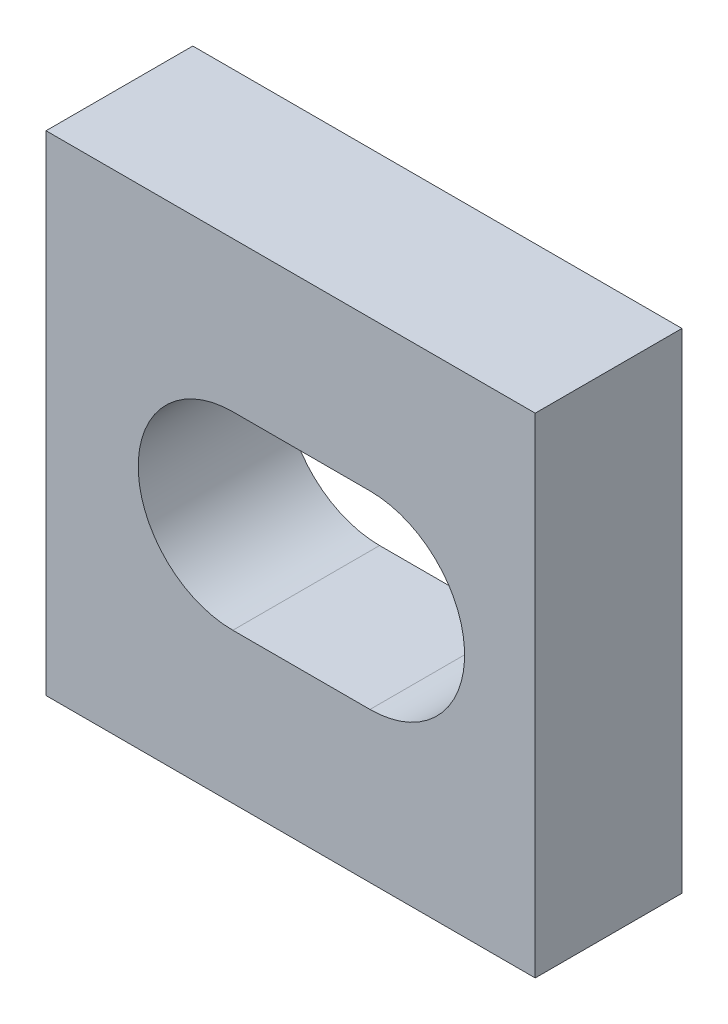
ISO-10303-21;
HEADER;
FILE_DESCRIPTION(('STEP AP214'),'2;1');
FILE_NAME('part.step','',(''),(''),'','','');
FILE_SCHEMA(('AUTOMOTIVE_DESIGN { 1 0 10303 214 1 1 1 1 }'));
ENDSEC;
DATA;
#1=APPLICATION_CONTEXT('core data for automotive mechanical design processes');
#2=APPLICATION_PROTOCOL_DEFINITION('international standard','automotive_design',2000,#1);
#3=PRODUCT_CONTEXT('',#1,'mechanical');
#4=PRODUCT('Part','Part','',(#3));
#5=PRODUCT_RELATED_PRODUCT_CATEGORY('part','',(#4));
#6=PRODUCT_DEFINITION_FORMATION('','',#4);
#7=PRODUCT_DEFINITION_CONTEXT('part definition',#1,'design');
#8=PRODUCT_DEFINITION('design','',#6,#7);
#9=PRODUCT_DEFINITION_SHAPE('','',#8);
#10=(LENGTH_UNIT() NAMED_UNIT(*) SI_UNIT(.MILLI.,.METRE.));
#11=(NAMED_UNIT(*) PLANE_ANGLE_UNIT() SI_UNIT($,.RADIAN.));
#12=(NAMED_UNIT(*) SI_UNIT($,.STERADIAN.) SOLID_ANGLE_UNIT());
#13=UNCERTAINTY_MEASURE_WITH_UNIT(LENGTH_MEASURE(1.E-05),#10,'distance_accuracy_value','');
#14=(GEOMETRIC_REPRESENTATION_CONTEXT(3) GLOBAL_UNCERTAINTY_ASSIGNED_CONTEXT((#13)) GLOBAL_UNIT_ASSIGNED_CONTEXT((#10,
#11,#12)) REPRESENTATION_CONTEXT('',''));
#15=CARTESIAN_POINT('',(0.,0.,0.));
#16=DIRECTION('',(0.,0.,1.));
#17=DIRECTION('',(1.,0.,0.));
#18=AXIS2_PLACEMENT_3D('',#15,#16,#17);
#19=CARTESIAN_POINT('',(0.,0.,3.));
#20=DIRECTION('',(0.,0.,1.));
#21=DIRECTION('',(1.,0.,0.));
#22=AXIS2_PLACEMENT_3D('',#19,#20,#21);
#23=PLANE('',#22);
#24=DIRECTION('',(0.,-1.,0.));
#25=VECTOR('',#24,1.);
#26=CARTESIAN_POINT('',(0.,0.,3.));
#27=LINE('',#26,#25);
#28=CARTESIAN_POINT('',(0.,0.,3.));
#29=VERTEX_POINT('',#28);
#30=CARTESIAN_POINT('',(0.,-10.,3.));
#31=VERTEX_POINT('',#30);
#32=EDGE_CURVE('E137',#29,#31,#27,.T.);
#33=ORIENTED_EDGE('',*,*,#32,.T.);
#34=DIRECTION('',(1.,0.,0.));
#35=VECTOR('',#34,1.);
#36=CARTESIAN_POINT('',(0.,-10.,3.));
#37=LINE('',#36,#35);
#38=CARTESIAN_POINT('',(10.,-10.,3.));
#39=VERTEX_POINT('',#38);
#40=EDGE_CURVE('E140',#31,#39,#37,.T.);
#41=ORIENTED_EDGE('',*,*,#40,.T.);
#42=DIRECTION('',(0.,1.,0.));
#43=VECTOR('',#42,1.);
#44=CARTESIAN_POINT('',(10.,0.,3.));
#45=LINE('',#44,#43);
#46=CARTESIAN_POINT('',(10.,0.,3.));
#47=VERTEX_POINT('',#46);
#48=EDGE_CURVE('E143',#39,#47,#45,.T.);
#49=ORIENTED_EDGE('',*,*,#48,.T.);
#50=DIRECTION('',(-1.,0.,0.));
#51=VECTOR('',#50,1.);
#52=CARTESIAN_POINT('',(0.,0.,3.));
#53=LINE('',#52,#51);
#54=EDGE_CURVE('E145',#47,#29,#53,.T.);
#55=ORIENTED_EDGE('',*,*,#54,.T.);
#56=EDGE_LOOP('',(#33,#41,#49,#55));
#57=FACE_BOUND('',#56,.T.);
#58=DIRECTION('',(1.,0.,0.));
#59=VECTOR('',#58,1.);
#60=CARTESIAN_POINT('',(3.81846847048423,-6.93423852947102,3.));
#61=LINE('',#60,#59);
#62=CARTESIAN_POINT('',(3.81846847048423,-6.93423852947102,3.));
#63=VERTEX_POINT('',#62);
#64=CARTESIAN_POINT('',(6.62231370719191,-6.93423852947102,3.));
#65=VERTEX_POINT('',#64);
#66=EDGE_CURVE('E109',#63,#65,#61,.T.);
#67=ORIENTED_EDGE('',*,*,#66,.F.);
#68=CARTESIAN_POINT('',(3.81846847048423,-5.,3.));
#69=DIRECTION('',(0.,0.,1.));
#70=DIRECTION('',(1.,0.,0.));
#71=AXIS2_PLACEMENT_3D('',#68,#69,#70);
#72=CIRCLE('',#71,1.93423852947102);
#73=CARTESIAN_POINT('',(3.81846847048423,-3.06576147052898,3.));
#74=VERTEX_POINT('',#73);
#75=EDGE_CURVE('E101',#74,#63,#72,.T.);
#76=ORIENTED_EDGE('',*,*,#75,.F.);
#77=DIRECTION('',(-1.,0.,0.));
#78=VECTOR('',#77,1.);
#79=CARTESIAN_POINT('',(3.81846847048423,-3.06576147052898,3.));
#80=LINE('',#79,#78);
#81=CARTESIAN_POINT('',(6.62231370719191,-3.06576147052898,3.));
#82=VERTEX_POINT('',#81);
#83=EDGE_CURVE('E123',#82,#74,#80,.T.);
#84=ORIENTED_EDGE('',*,*,#83,.F.);
#85=CARTESIAN_POINT('',(6.62231370719191,-5.,3.));
#86=DIRECTION('',(0.,0.,1.));
#87=DIRECTION('',(1.,0.,0.));
#88=AXIS2_PLACEMENT_3D('',#85,#86,#87);
#89=CIRCLE('',#88,1.93423852947102);
#90=EDGE_CURVE('E121',#65,#82,#89,.T.);
#91=ORIENTED_EDGE('',*,*,#90,.F.);
#92=EDGE_LOOP('',(#67,#76,#84,#91));
#93=FACE_BOUND('',#92,.T.);
#94=ADVANCED_FACE('F36',(#57,#93),#23,.T.);
#95=CARTESIAN_POINT('',(0.,0.,0.));
#96=DIRECTION('',(0.,0.,1.));
#97=DIRECTION('',(1.,0.,0.));
#98=AXIS2_PLACEMENT_3D('',#95,#96,#97);
#99=PLANE('',#98);
#100=DIRECTION('',(0.,-1.,0.));
#101=VECTOR('',#100,1.);
#102=CARTESIAN_POINT('',(0.,0.,0.));
#103=LINE('',#102,#101);
#104=CARTESIAN_POINT('',(0.,0.,0.));
#105=VERTEX_POINT('',#104);
#106=CARTESIAN_POINT('',(0.,-10.,0.));
#107=VERTEX_POINT('',#106);
#108=EDGE_CURVE('E117',#105,#107,#103,.T.);
#109=ORIENTED_EDGE('',*,*,#108,.F.);
#110=DIRECTION('',(-1.,0.,0.));
#111=VECTOR('',#110,1.);
#112=CARTESIAN_POINT('',(0.,0.,0.));
#113=LINE('',#112,#111);
#114=CARTESIAN_POINT('',(10.,0.,0.));
#115=VERTEX_POINT('',#114);
#116=EDGE_CURVE('E141',#115,#105,#113,.T.);
#117=ORIENTED_EDGE('',*,*,#116,.F.);
#118=DIRECTION('',(0.,1.,0.));
#119=VECTOR('',#118,1.);
#120=CARTESIAN_POINT('',(10.,0.,0.));
#121=LINE('',#120,#119);
#122=CARTESIAN_POINT('',(10.,-10.,0.));
#123=VERTEX_POINT('',#122);
#124=EDGE_CURVE('E152',#123,#115,#121,.T.);
#125=ORIENTED_EDGE('',*,*,#124,.F.);
#126=DIRECTION('',(1.,0.,0.));
#127=VECTOR('',#126,1.);
#128=CARTESIAN_POINT('',(0.,-10.,0.));
#129=LINE('',#128,#127);
#130=EDGE_CURVE('E150',#107,#123,#129,.T.);
#131=ORIENTED_EDGE('',*,*,#130,.F.);
#132=EDGE_LOOP('',(#109,#117,#125,#131));
#133=FACE_BOUND('',#132,.T.);
#134=CARTESIAN_POINT('',(3.81846847048423,-5.,0.));
#135=DIRECTION('',(0.,0.,1.));
#136=DIRECTION('',(1.,0.,0.));
#137=AXIS2_PLACEMENT_3D('',#134,#135,#136);
#138=CIRCLE('',#137,1.93423852947102);
#139=CARTESIAN_POINT('',(3.81846847048423,-3.06576147052898,0.));
#140=VERTEX_POINT('',#139);
#141=CARTESIAN_POINT('',(3.81846847048423,-6.93423852947102,0.));
#142=VERTEX_POINT('',#141);
#143=EDGE_CURVE('E59',#140,#142,#138,.T.);
#144=ORIENTED_EDGE('',*,*,#143,.T.);
#145=DIRECTION('',(1.,0.,0.));
#146=VECTOR('',#145,1.);
#147=CARTESIAN_POINT('',(3.81846847048423,-6.93423852947102,0.));
#148=LINE('',#147,#146);
#149=CARTESIAN_POINT('',(6.62231370719191,-6.93423852947102,0.));
#150=VERTEX_POINT('',#149);
#151=EDGE_CURVE('E116',#142,#150,#148,.T.);
#152=ORIENTED_EDGE('',*,*,#151,.T.);
#153=CARTESIAN_POINT('',(6.62231370719191,-5.,0.));
#154=DIRECTION('',(0.,0.,1.));
#155=DIRECTION('',(1.,0.,0.));
#156=AXIS2_PLACEMENT_3D('',#153,#154,#155);
#157=CIRCLE('',#156,1.93423852947102);
#158=CARTESIAN_POINT('',(6.62231370719191,-3.06576147052898,0.));
#159=VERTEX_POINT('',#158);
#160=EDGE_CURVE('E129',#150,#159,#157,.T.);
#161=ORIENTED_EDGE('',*,*,#160,.T.);
#162=DIRECTION('',(-1.,0.,0.));
#163=VECTOR('',#162,1.);
#164=CARTESIAN_POINT('',(3.81846847048423,-3.06576147052898,0.));
#165=LINE('',#164,#163);
#166=EDGE_CURVE('E110',#159,#140,#165,.T.);
#167=ORIENTED_EDGE('',*,*,#166,.T.);
#168=EDGE_LOOP('',(#144,#152,#161,#167));
#169=FACE_BOUND('',#168,.T.);
#170=ADVANCED_FACE('F170',(#133,#169),#99,.F.);
#171=CARTESIAN_POINT('',(0.,0.,3.));
#172=DIRECTION('',(1.,0.,0.));
#173=DIRECTION('',(0.,0.,-1.));
#174=AXIS2_PLACEMENT_3D('',#171,#172,#173);
#175=PLANE('',#174);
#176=ORIENTED_EDGE('',*,*,#108,.T.);
#177=DIRECTION('',(0.,0.,-1.));
#178=VECTOR('',#177,1.);
#179=CARTESIAN_POINT('',(0.,-10.,3.));
#180=LINE('',#179,#178);
#181=EDGE_CURVE('E11',#31,#107,#180,.T.);
#182=ORIENTED_EDGE('',*,*,#181,.F.);
#183=ORIENTED_EDGE('',*,*,#32,.F.);
#184=DIRECTION('',(0.,0.,-1.));
#185=VECTOR('',#184,1.);
#186=CARTESIAN_POINT('',(0.,0.,3.));
#187=LINE('',#186,#185);
#188=EDGE_CURVE('E147',#29,#105,#187,.T.);
#189=ORIENTED_EDGE('',*,*,#188,.T.);
#190=EDGE_LOOP('',(#176,#182,#183,#189));
#191=FACE_BOUND('',#190,.T.);
#192=ADVANCED_FACE('F38',(#191),#175,.F.);
#193=CARTESIAN_POINT('',(0.,-10.,3.));
#194=DIRECTION('',(0.,1.,0.));
#195=DIRECTION('',(0.,0.,1.));
#196=AXIS2_PLACEMENT_3D('',#193,#194,#195);
#197=PLANE('',#196);
#198=ORIENTED_EDGE('',*,*,#130,.T.);
#199=DIRECTION('',(0.,0.,-1.));
#200=VECTOR('',#199,1.);
#201=CARTESIAN_POINT('',(10.,-10.,3.));
#202=LINE('',#201,#200);
#203=EDGE_CURVE('E44',#39,#123,#202,.T.);
#204=ORIENTED_EDGE('',*,*,#203,.F.);
#205=ORIENTED_EDGE('',*,*,#40,.F.);
#206=ORIENTED_EDGE('',*,*,#181,.T.);
#207=EDGE_LOOP('',(#198,#204,#205,#206));
#208=FACE_BOUND('',#207,.T.);
#209=ADVANCED_FACE('F180',(#208),#197,.F.);
#210=CARTESIAN_POINT('',(10.,0.,3.));
#211=DIRECTION('',(-1.,0.,0.));
#212=DIRECTION('',(0.,-1.,0.));
#213=AXIS2_PLACEMENT_3D('',#210,#211,#212);
#214=PLANE('',#213);
#215=ORIENTED_EDGE('',*,*,#124,.T.);
#216=DIRECTION('',(0.,0.,-1.));
#217=VECTOR('',#216,1.);
#218=CARTESIAN_POINT('',(10.,0.,3.));
#219=LINE('',#218,#217);
#220=EDGE_CURVE('E157',#47,#115,#219,.T.);
#221=ORIENTED_EDGE('',*,*,#220,.F.);
#222=ORIENTED_EDGE('',*,*,#48,.F.);
#223=ORIENTED_EDGE('',*,*,#203,.T.);
#224=EDGE_LOOP('',(#215,#221,#222,#223));
#225=FACE_BOUND('',#224,.T.);
#226=ADVANCED_FACE('F164',(#225),#214,.F.);
#227=CARTESIAN_POINT('',(0.,0.,3.));
#228=DIRECTION('',(0.,-1.,0.));
#229=DIRECTION('',(0.,0.,-1.));
#230=AXIS2_PLACEMENT_3D('',#227,#228,#229);
#231=PLANE('',#230);
#232=ORIENTED_EDGE('',*,*,#116,.T.);
#233=ORIENTED_EDGE('',*,*,#188,.F.);
#234=ORIENTED_EDGE('',*,*,#54,.F.);
#235=ORIENTED_EDGE('',*,*,#220,.T.);
#236=EDGE_LOOP('',(#232,#233,#234,#235));
#237=FACE_BOUND('',#236,.T.);
#238=ADVANCED_FACE('F174',(#237),#231,.F.);
#239=CARTESIAN_POINT('',(3.81846847048423,-5.,3.));
#240=DIRECTION('',(0.,0.,-1.));
#241=DIRECTION('',(-1.,0.,0.));
#242=AXIS2_PLACEMENT_3D('',#239,#240,#241);
#243=CYLINDRICAL_SURFACE('',#242,1.93423852947102);
#244=ORIENTED_EDGE('',*,*,#143,.F.);
#245=DIRECTION('',(0.,0.,-1.));
#246=VECTOR('',#245,1.);
#247=CARTESIAN_POINT('',(3.81846847048423,-3.06576147052898,3.));
#248=LINE('',#247,#246);
#249=EDGE_CURVE('E105',#74,#140,#248,.T.);
#250=ORIENTED_EDGE('',*,*,#249,.F.);
#251=ORIENTED_EDGE('',*,*,#75,.T.);
#252=DIRECTION('',(0.,0.,-1.));
#253=VECTOR('',#252,1.);
#254=CARTESIAN_POINT('',(3.81846847048423,-6.93423852947102,3.));
#255=LINE('',#254,#253);
#256=EDGE_CURVE('E104',#63,#142,#255,.T.);
#257=ORIENTED_EDGE('',*,*,#256,.T.);
#258=EDGE_LOOP('',(#244,#250,#251,#257));
#259=FACE_BOUND('',#258,.T.);
#260=ADVANCED_FACE('F103',(#259),#243,.F.);
#261=CARTESIAN_POINT('',(3.81846847048423,-6.93423852947102,3.));
#262=DIRECTION('',(0.,1.,0.));
#263=DIRECTION('',(0.,0.,1.));
#264=AXIS2_PLACEMENT_3D('',#261,#262,#263);
#265=PLANE('',#264);
#266=ORIENTED_EDGE('',*,*,#151,.F.);
#267=ORIENTED_EDGE('',*,*,#256,.F.);
#268=ORIENTED_EDGE('',*,*,#66,.T.);
#269=DIRECTION('',(0.,0.,-1.));
#270=VECTOR('',#269,1.);
#271=CARTESIAN_POINT('',(6.62231370719191,-6.93423852947102,3.));
#272=LINE('',#271,#270);
#273=EDGE_CURVE('E118',#65,#150,#272,.T.);
#274=ORIENTED_EDGE('',*,*,#273,.T.);
#275=EDGE_LOOP('',(#266,#267,#268,#274));
#276=FACE_BOUND('',#275,.T.);
#277=ADVANCED_FACE('F113',(#276),#265,.T.);
#278=CARTESIAN_POINT('',(6.62231370719191,-5.,3.));
#279=DIRECTION('',(0.,0.,-1.));
#280=DIRECTION('',(-1.,0.,0.));
#281=AXIS2_PLACEMENT_3D('',#278,#279,#280);
#282=CYLINDRICAL_SURFACE('',#281,1.93423852947102);
#283=ORIENTED_EDGE('',*,*,#160,.F.);
#284=ORIENTED_EDGE('',*,*,#273,.F.);
#285=ORIENTED_EDGE('',*,*,#90,.T.);
#286=DIRECTION('',(0.,0.,-1.));
#287=VECTOR('',#286,1.);
#288=CARTESIAN_POINT('',(6.62231370719191,-3.06576147052898,3.));
#289=LINE('',#288,#287);
#290=EDGE_CURVE('E51',#82,#159,#289,.T.);
#291=ORIENTED_EDGE('',*,*,#290,.T.);
#292=EDGE_LOOP('',(#283,#284,#285,#291));
#293=FACE_BOUND('',#292,.T.);
#294=ADVANCED_FACE('F203',(#293),#282,.F.);
#295=CARTESIAN_POINT('',(3.81846847048423,-3.06576147052898,3.));
#296=DIRECTION('',(0.,-1.,0.));
#297=DIRECTION('',(0.,0.,-1.));
#298=AXIS2_PLACEMENT_3D('',#295,#296,#297);
#299=PLANE('',#298);
#300=ORIENTED_EDGE('',*,*,#166,.F.);
#301=ORIENTED_EDGE('',*,*,#290,.F.);
#302=ORIENTED_EDGE('',*,*,#83,.T.);
#303=ORIENTED_EDGE('',*,*,#249,.T.);
#304=EDGE_LOOP('',(#300,#301,#302,#303));
#305=FACE_BOUND('',#304,.T.);
#306=ADVANCED_FACE('F207',(#305),#299,.T.);
#307=CLOSED_SHELL('',(#94,#170,#192,#209,#226,#238,#260,#277,#294,#306));
#308=MANIFOLD_SOLID_BREP('B2',#307);
#309=ADVANCED_BREP_SHAPE_REPRESENTATION('',(#18,#308),#14);
#310=SHAPE_DEFINITION_REPRESENTATION(#9,#309);
ENDSEC;
END-ISO-10303-21;
